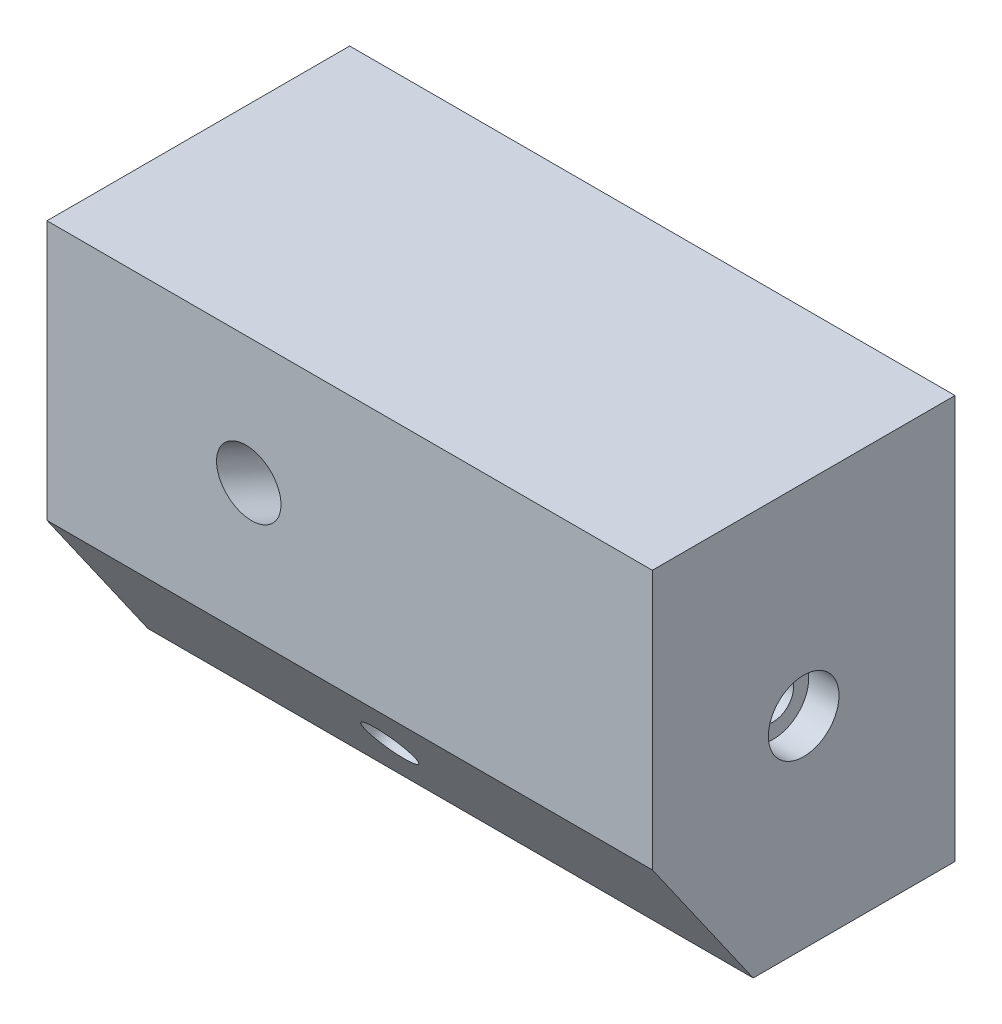
ISO-10303-21;
HEADER;
FILE_DESCRIPTION(('STEP AP214'),'2;1');
FILE_NAME('part.step','',(''),(''),'','','');
FILE_SCHEMA(('AUTOMOTIVE_DESIGN { 1 0 10303 214 1 1 1 1 }'));
ENDSEC;
DATA;
#1=APPLICATION_CONTEXT('core data for automotive mechanical design processes');
#2=APPLICATION_PROTOCOL_DEFINITION('international standard','automotive_design',2000,#1);
#3=PRODUCT_CONTEXT('',#1,'mechanical');
#4=PRODUCT('Part','Part','',(#3));
#5=PRODUCT_RELATED_PRODUCT_CATEGORY('part','',(#4));
#6=PRODUCT_DEFINITION_FORMATION('','',#4);
#7=PRODUCT_DEFINITION_CONTEXT('part definition',#1,'design');
#8=PRODUCT_DEFINITION('design','',#6,#7);
#9=PRODUCT_DEFINITION_SHAPE('','',#8);
#10=(LENGTH_UNIT() NAMED_UNIT(*) SI_UNIT(.MILLI.,.METRE.));
#11=(NAMED_UNIT(*) PLANE_ANGLE_UNIT() SI_UNIT($,.RADIAN.));
#12=(NAMED_UNIT(*) SI_UNIT($,.STERADIAN.) SOLID_ANGLE_UNIT());
#13=UNCERTAINTY_MEASURE_WITH_UNIT(LENGTH_MEASURE(1.E-05),#10,'distance_accuracy_value','');
#14=(GEOMETRIC_REPRESENTATION_CONTEXT(3) GLOBAL_UNCERTAINTY_ASSIGNED_CONTEXT((#13)) GLOBAL_UNIT_ASSIGNED_CONTEXT((#10,
#11,#12)) REPRESENTATION_CONTEXT('',''));
#15=CARTESIAN_POINT('',(0.,0.,0.));
#16=DIRECTION('',(0.,0.,1.));
#17=DIRECTION('',(1.,0.,0.));
#18=AXIS2_PLACEMENT_3D('',#15,#16,#17);
#19=CARTESIAN_POINT('',(0.,80.,60.));
#20=DIRECTION('',(1.,0.,0.));
#21=DIRECTION('',(0.,0.,-1.));
#22=AXIS2_PLACEMENT_3D('',#19,#20,#21);
#23=PLANE('',#22);
#24=DIRECTION('',(0.,0.819151562686394,0.573577124150222));
#25=VECTOR('',#24,1.);
#26=CARTESIAN_POINT('',(0.,31.4192,62.));
#27=LINE('',#26,#25);
#28=CARTESIAN_POINT('',(0.,0.,40.));
#29=VERTEX_POINT('',#28);
#30=CARTESIAN_POINT('',(0.,28.5629090909091,60.));
#31=VERTEX_POINT('',#30);
#32=EDGE_CURVE('E149',#29,#31,#27,.T.);
#33=ORIENTED_EDGE('',*,*,#32,.T.);
#34=DIRECTION('',(0.,-1.,0.));
#35=VECTOR('',#34,1.);
#36=CARTESIAN_POINT('',(0.,80.,60.));
#37=LINE('',#36,#35);
#38=CARTESIAN_POINT('',(0.,80.,60.));
#39=VERTEX_POINT('',#38);
#40=EDGE_CURVE('E112',#39,#31,#37,.T.);
#41=ORIENTED_EDGE('',*,*,#40,.F.);
#42=DIRECTION('',(0.,0.,-1.));
#43=VECTOR('',#42,1.);
#44=CARTESIAN_POINT('',(0.,80.,60.));
#45=LINE('',#44,#43);
#46=CARTESIAN_POINT('',(0.,80.,0.));
#47=VERTEX_POINT('',#46);
#48=EDGE_CURVE('E104',#39,#47,#45,.T.);
#49=ORIENTED_EDGE('',*,*,#48,.T.);
#50=DIRECTION('',(0.,-1.,0.));
#51=VECTOR('',#50,1.);
#52=CARTESIAN_POINT('',(0.,80.,0.));
#53=LINE('',#52,#51);
#54=CARTESIAN_POINT('',(0.,0.,0.));
#55=VERTEX_POINT('',#54);
#56=EDGE_CURVE('E119',#47,#55,#53,.T.);
#57=ORIENTED_EDGE('',*,*,#56,.T.);
#58=DIRECTION('',(0.,0.,-1.));
#59=VECTOR('',#58,1.);
#60=CARTESIAN_POINT('',(0.,0.,60.));
#61=LINE('',#60,#59);
#62=EDGE_CURVE('E66',#29,#55,#61,.T.);
#63=ORIENTED_EDGE('',*,*,#62,.F.);
#64=EDGE_LOOP('',(#33,#41,#49,#57,#63));
#65=FACE_BOUND('',#64,.T.);
#66=ADVANCED_FACE('F57',(#65),#23,.F.);
#67=CARTESIAN_POINT('',(0.,0.,60.));
#68=DIRECTION('',(0.,1.,0.));
#69=DIRECTION('',(0.,0.,1.));
#70=AXIS2_PLACEMENT_3D('',#67,#68,#69);
#71=PLANE('',#70);
#72=DIRECTION('',(-1.,0.,0.));
#73=VECTOR('',#72,1.);
#74=CARTESIAN_POINT('',(120.,0.,40.));
#75=LINE('',#74,#73);
#76=CARTESIAN_POINT('',(120.,0.,40.));
#77=VERTEX_POINT('',#76);
#78=EDGE_CURVE('E127',#77,#29,#75,.T.);
#79=ORIENTED_EDGE('',*,*,#78,.T.);
#80=ORIENTED_EDGE('',*,*,#62,.T.);
#81=DIRECTION('',(1.,0.,0.));
#82=VECTOR('',#81,1.);
#83=CARTESIAN_POINT('',(0.,0.,0.));
#84=LINE('',#83,#82);
#85=CARTESIAN_POINT('',(120.,0.,0.));
#86=VERTEX_POINT('',#85);
#87=EDGE_CURVE('E125',#55,#86,#84,.T.);
#88=ORIENTED_EDGE('',*,*,#87,.T.);
#89=DIRECTION('',(0.,0.,-1.));
#90=VECTOR('',#89,1.);
#91=CARTESIAN_POINT('',(120.,0.,60.));
#92=LINE('',#91,#90);
#93=EDGE_CURVE('E142',#77,#86,#92,.T.);
#94=ORIENTED_EDGE('',*,*,#93,.F.);
#95=EDGE_LOOP('',(#79,#80,#88,#94));
#96=FACE_BOUND('',#95,.T.);
#97=ADVANCED_FACE('F186',(#96),#71,.F.);
#98=CARTESIAN_POINT('',(120.,0.,60.));
#99=DIRECTION('',(-1.,0.,0.));
#100=DIRECTION('',(0.,0.,1.));
#101=AXIS2_PLACEMENT_3D('',#98,#99,#100);
#102=PLANE('',#101);
#103=CARTESIAN_POINT('',(120.,40.,30.));
#104=DIRECTION('',(1.,0.,0.));
#105=DIRECTION('',(0.,0.,-1.));
#106=AXIS2_PLACEMENT_3D('',#103,#104,#105);
#107=CIRCLE('',#106,7.);
#108=CARTESIAN_POINT('',(120.,40.,23.));
#109=VERTEX_POINT('',#108);
#110=EDGE_CURVE('E235',#109,#109,#107,.T.);
#111=ORIENTED_EDGE('',*,*,#110,.F.);
#112=EDGE_LOOP('',(#111));
#113=FACE_BOUND('',#112,.T.);
#114=DIRECTION('',(0.,0.819151562686394,0.573577124150222));
#115=VECTOR('',#114,1.);
#116=CARTESIAN_POINT('',(120.,31.4192,62.));
#117=LINE('',#116,#115);
#118=CARTESIAN_POINT('',(120.,28.5629090909091,60.));
#119=VERTEX_POINT('',#118);
#120=EDGE_CURVE('E74',#77,#119,#117,.T.);
#121=ORIENTED_EDGE('',*,*,#120,.F.);
#122=ORIENTED_EDGE('',*,*,#93,.T.);
#123=DIRECTION('',(0.,1.,0.));
#124=VECTOR('',#123,1.);
#125=CARTESIAN_POINT('',(120.,0.,0.));
#126=LINE('',#125,#124);
#127=CARTESIAN_POINT('',(120.,80.,0.));
#128=VERTEX_POINT('',#127);
#129=EDGE_CURVE('E113',#86,#128,#126,.T.);
#130=ORIENTED_EDGE('',*,*,#129,.T.);
#131=DIRECTION('',(0.,0.,-1.));
#132=VECTOR('',#131,1.);
#133=CARTESIAN_POINT('',(120.,80.,60.));
#134=LINE('',#133,#132);
#135=CARTESIAN_POINT('',(120.,80.,60.));
#136=VERTEX_POINT('',#135);
#137=EDGE_CURVE('E107',#136,#128,#134,.T.);
#138=ORIENTED_EDGE('',*,*,#137,.F.);
#139=DIRECTION('',(0.,1.,0.));
#140=VECTOR('',#139,1.);
#141=CARTESIAN_POINT('',(120.,0.,60.));
#142=LINE('',#141,#140);
#143=EDGE_CURVE('E218',#119,#136,#142,.T.);
#144=ORIENTED_EDGE('',*,*,#143,.F.);
#145=EDGE_LOOP('',(#121,#122,#130,#138,#144));
#146=FACE_BOUND('',#145,.T.);
#147=ADVANCED_FACE('F189',(#113,#146),#102,.F.);
#148=CARTESIAN_POINT('',(0.,0.,60.));
#149=DIRECTION('',(0.,0.,1.));
#150=DIRECTION('',(1.,0.,0.));
#151=AXIS2_PLACEMENT_3D('',#148,#149,#150);
#152=PLANE('',#151);
#153=CARTESIAN_POINT('',(40.0000003036419,55.0000000980999,60.));
#154=DIRECTION('',(0.,0.,1.));
#155=DIRECTION('',(0.80530872119161,-0.592855685283302,0.));
#156=AXIS2_PLACEMENT_3D('',#153,#154,#155);
#157=ELLIPSE('',#156,6.58435719353539,6.);
#158=CARTESIAN_POINT('',(45.3024405750366,51.0964265019764,60.));
#159=VERTEX_POINT('',#158);
#160=EDGE_CURVE('E147',#159,#159,#157,.T.);
#161=ORIENTED_EDGE('',*,*,#160,.F.);
#162=EDGE_LOOP('',(#161));
#163=FACE_BOUND('',#162,.T.);
#164=ORIENTED_EDGE('',*,*,#40,.T.);
#165=DIRECTION('',(1.,0.,0.));
#166=VECTOR('',#165,1.);
#167=CARTESIAN_POINT('',(0.,28.5629090909091,60.));
#168=LINE('',#167,#166);
#169=EDGE_CURVE('E12',#31,#119,#168,.T.);
#170=ORIENTED_EDGE('',*,*,#169,.T.);
#171=ORIENTED_EDGE('',*,*,#143,.T.);
#172=DIRECTION('',(-1.,0.,0.));
#173=VECTOR('',#172,1.);
#174=CARTESIAN_POINT('',(120.,80.,60.));
#175=LINE('',#174,#173);
#176=EDGE_CURVE('E82',#136,#39,#175,.T.);
#177=ORIENTED_EDGE('',*,*,#176,.T.);
#178=EDGE_LOOP('',(#164,#170,#171,#177));
#179=FACE_BOUND('',#178,.T.);
#180=ADVANCED_FACE('F193',(#163,#179),#152,.T.);
#181=CARTESIAN_POINT('',(120.,80.,60.));
#182=DIRECTION('',(0.,-1.,0.));
#183=DIRECTION('',(0.,0.,-1.));
#184=AXIS2_PLACEMENT_3D('',#181,#182,#183);
#185=PLANE('',#184);
#186=DIRECTION('',(-1.,0.,0.));
#187=VECTOR('',#186,1.);
#188=CARTESIAN_POINT('',(120.,80.,0.));
#189=LINE('',#188,#187);
#190=EDGE_CURVE('E101',#128,#47,#189,.T.);
#191=ORIENTED_EDGE('',*,*,#190,.T.);
#192=ORIENTED_EDGE('',*,*,#48,.F.);
#193=ORIENTED_EDGE('',*,*,#176,.F.);
#194=ORIENTED_EDGE('',*,*,#137,.T.);
#195=EDGE_LOOP('',(#191,#192,#193,#194));
#196=FACE_BOUND('',#195,.T.);
#197=ADVANCED_FACE('F103',(#196),#185,.F.);
#198=CARTESIAN_POINT('',(0.,0.,0.));
#199=DIRECTION('',(0.,0.,1.));
#200=DIRECTION('',(1.,0.,0.));
#201=AXIS2_PLACEMENT_3D('',#198,#199,#200);
#202=PLANE('',#201);
#203=ORIENTED_EDGE('',*,*,#56,.F.);
#204=ORIENTED_EDGE('',*,*,#190,.F.);
#205=ORIENTED_EDGE('',*,*,#129,.F.);
#206=ORIENTED_EDGE('',*,*,#87,.F.);
#207=EDGE_LOOP('',(#203,#204,#205,#206));
#208=FACE_BOUND('',#207,.T.);
#209=ADVANCED_FACE('F123',(#208),#202,.F.);
#210=CARTESIAN_POINT('',(120.,31.4192,62.));
#211=DIRECTION('',(0.,-0.573577124150222,0.819151562686394));
#212=DIRECTION('',(0.,-0.819151562686394,-0.573577124150222));
#213=AXIS2_PLACEMENT_3D('',#210,#211,#212);
#214=PLANE('',#213);
#215=CARTESIAN_POINT('',(57.9402,14.2814852266807,50.0000214832642));
#216=DIRECTION('',(0.,-0.573577124150222,0.819151562686394));
#217=DIRECTION('',(0.,-0.819151562686394,-0.573577124150222));
#218=AXIS2_PLACEMENT_3D('',#215,#216,#217);
#219=CIRCLE('',#218,5.);
#220=CARTESIAN_POINT('',(57.9402,10.1857274132487,47.1321358625131));
#221=VERTEX_POINT('',#220);
#222=EDGE_CURVE('E159',#221,#221,#219,.T.);
#223=ORIENTED_EDGE('',*,*,#222,.F.);
#224=EDGE_LOOP('',(#223));
#225=FACE_BOUND('',#224,.T.);
#226=ORIENTED_EDGE('',*,*,#32,.F.);
#227=ORIENTED_EDGE('',*,*,#78,.F.);
#228=ORIENTED_EDGE('',*,*,#120,.T.);
#229=ORIENTED_EDGE('',*,*,#169,.F.);
#230=EDGE_LOOP('',(#226,#227,#228,#229));
#231=FACE_BOUND('',#230,.T.);
#232=ADVANCED_FACE('F181',(#225,#231),#214,.T.);
#233=CARTESIAN_POINT('',(36.683319,57.441689,69.112507));
#234=DIRECTION('',(0.331668124744669,-0.244168886053008,-0.911250684560504));
#235=DIRECTION('',(-0.939692620915183,0.,-0.342020142970491));
#236=AXIS2_PLACEMENT_3D('',#233,#234,#235);
#237=CYLINDRICAL_SURFACE('',#236,6.);
#238=CARTESIAN_POINT('',(57.9402,39.8426155637151,22.2121782988887));
#239=CARTESIAN_POINT('',(57.8039877038304,39.784658133727,22.2949512649592));
#240=CARTESIAN_POINT('',(57.6635682031201,39.7252941387798,22.370047816477));
#241=CARTESIAN_POINT('',(57.3744584749812,39.6042422034476,22.500326589461));
#242=CARTESIAN_POINT('',(57.2257633712298,39.5425528999544,22.5554969230898));
#243=CARTESIAN_POINT('',(56.9194975007161,39.417096514862,22.6406415910337));
#244=CARTESIAN_POINT('',(56.7618422358309,39.3533134510199,22.670308605789));
#245=CARTESIAN_POINT('',(56.5232831422183,39.2583231771456,22.6905297322477));
#246=CARTESIAN_POINT('',(56.4434540827091,39.2267879519921,22.6932278134429));
#247=CARTESIAN_POINT('',(56.283738837589,39.1642408542226,22.6900248079423));
#248=CARTESIAN_POINT('',(56.2038526637015,39.1332288953494,22.6841251528194));
#249=CARTESIAN_POINT('',(56.0520564241629,39.0748547177211,22.6643405599156));
#250=CARTESIAN_POINT('',(55.9800754977155,39.047415192346,22.6512219589239));
#251=CARTESIAN_POINT('',(55.8374424177545,38.9935381506762,22.6175963195989));
#252=CARTESIAN_POINT('',(55.7667907437992,38.967100992644,22.5970866665885));
#253=CARTESIAN_POINT('',(55.627504110675,38.9154831158034,22.548909853829));
#254=CARTESIAN_POINT('',(55.5588690326735,38.8903023228995,22.5212431167735));
#255=CARTESIAN_POINT('',(55.4241563982202,38.8413759316318,22.4591970009049));
#256=CARTESIAN_POINT('',(55.3580799645361,38.8176309608161,22.4248147143347));
#257=CARTESIAN_POINT('',(55.1794735876445,38.7541203356935,22.3212182566648));
#258=CARTESIAN_POINT('',(55.0700865585192,38.7159988252894,22.2454824077129));
#259=CARTESIAN_POINT('',(54.8620666969831,38.6448703505473,22.0787314452129));
#260=CARTESIAN_POINT('',(54.7634365064151,38.6118646417982,21.9877125920877));
#261=CARTESIAN_POINT('',(54.5124752690338,38.5295082879465,21.727059984335));
#262=CARTESIAN_POINT('',(54.3700026157656,38.4845774065977,21.5464898902117));
#263=CARTESIAN_POINT('',(54.176855989345,38.4255962595804,21.2605179673358));
#264=CARTESIAN_POINT('',(54.1158095358231,38.4073131086461,21.1624842382393));
#265=CARTESIAN_POINT('',(53.9999820837577,38.3732108648322,20.9623564872389));
#266=CARTESIAN_POINT('',(53.9451998596722,38.3573912897556,20.8602632648253));
#267=CARTESIAN_POINT('',(53.8003574398024,38.3162560387586,20.5710094609751));
#268=CARTESIAN_POINT('',(53.7166122865105,38.2933099450598,20.3803546926317));
#269=CARTESIAN_POINT('',(53.5647647249894,38.2527386291317,19.9923262880494));
#270=CARTESIAN_POINT('',(53.4966759300887,38.2351180333119,19.7949469746731));
#271=CARTESIAN_POINT('',(53.3738613755543,38.2038726046906,19.3949557389383));
#272=CARTESIAN_POINT('',(53.3191894595526,38.1902638292714,19.192326228102));
#273=CARTESIAN_POINT('',(53.221940735386,38.16602632568,18.7839746650922));
#274=CARTESIAN_POINT('',(53.1793680678022,38.155398617699,18.5782515795399));
#275=CARTESIAN_POINT('',(53.1096541511456,38.1372937806302,18.1896614138238));
#276=CARTESIAN_POINT('',(53.081272239508,38.1295913987907,18.0070239444184));
#277=CARTESIAN_POINT('',(53.0324493352196,38.1150709806842,17.6406540287694));
#278=CARTESIAN_POINT('',(53.0120086520074,38.1082529788849,17.4569215401405));
#279=CARTESIAN_POINT('',(52.9787024683646,38.0948118312487,17.0884685302951));
#280=CARTESIAN_POINT('',(52.9658492872428,38.0881890187976,16.9037468909687));
#281=CARTESIAN_POINT('',(52.9476321852254,38.0743986828511,16.5339548619442));
#282=CARTESIAN_POINT('',(52.9422682489295,38.067231160476,16.3488844729641));
#283=CARTESIAN_POINT('',(52.9391201342755,38.0515123411151,15.9795962017501));
#284=CARTESIAN_POINT('',(52.9413008079597,38.0429676371409,15.7953783591296));
#285=CARTESIAN_POINT('',(52.9535048957768,38.0234134902043,15.4272838070698));
#286=CARTESIAN_POINT('',(52.9635298226211,38.0124035721344,15.2434071702862));
#287=CARTESIAN_POINT('',(52.9920606058182,37.9866102967845,14.8769814151585));
#288=CARTESIAN_POINT('',(53.0105472034314,37.9718355419327,14.6944302334293));
#289=CARTESIAN_POINT('',(53.0570804146525,37.9367900121151,14.3311216204349));
#290=CARTESIAN_POINT('',(53.0851214707017,37.916522433569,14.1503632091265));
#291=CARTESIAN_POINT('',(53.1397055613891,37.8774002890075,13.8598226323932));
#292=CARTESIAN_POINT('',(53.1627976519762,37.8609149852681,13.7490742194168));
#293=CARTESIAN_POINT('',(53.2138772482162,37.8243205107313,13.5292884029596));
#294=CARTESIAN_POINT('',(53.2418651829162,37.8042110223239,13.4202511503496));
#295=CARTESIAN_POINT('',(53.3033130094751,37.7597290134358,13.2048518737301));
#296=CARTESIAN_POINT('',(53.3367604615043,37.7353661758782,13.0984843878288));
#297=CARTESIAN_POINT('',(53.409845760958,37.6817162173147,12.8892155903358));
#298=CARTESIAN_POINT('',(53.4494821398913,37.6524302643259,12.7863134635166));
#299=CARTESIAN_POINT('',(53.5624987182004,37.5684053474016,12.5227621489585));
#300=CARTESIAN_POINT('',(53.6415770887987,37.5091337125177,12.3658053312409));
#301=CARTESIAN_POINT('',(53.7753131002192,37.4092125097617,12.1447437015737));
#302=CARTESIAN_POINT('',(53.8224078487145,37.3740725424897,12.0734563894166));
#303=CARTESIAN_POINT('',(53.9216824543319,37.3004628436215,11.9363673717493));
#304=CARTESIAN_POINT('',(53.9738601953855,37.2619944983809,11.8705634044916));
#305=CARTESIAN_POINT('',(54.0832900949905,37.182190598304,11.7448992467268));
#306=CARTESIAN_POINT('',(54.1405533292255,37.140848830196,11.6850526628242));
#307=CARTESIAN_POINT('',(54.2597554481373,37.0561387077595,11.5718052489947));
#308=CARTESIAN_POINT('',(54.3216944170742,37.0127703169152,11.5184045352721));
#309=CARTESIAN_POINT('',(54.4499529392231,36.9247951491857,11.4180244436125));
#310=CARTESIAN_POINT('',(54.5162795577431,36.8801864454677,11.3710558156989));
#311=CARTESIAN_POINT('',(54.6527964886081,36.7906566100943,11.283444118957));
#312=CARTESIAN_POINT('',(54.7229878260814,36.7457353983326,11.2428027394989));
#313=CARTESIAN_POINT('',(54.8876066537276,36.6434673253295,11.1566075749145));
#314=CARTESIAN_POINT('',(54.9831730975512,36.5862836725856,11.1130317464522));
#315=CARTESIAN_POINT('',(55.1792027025236,36.4742232283291,11.0348566901161));
#316=CARTESIAN_POINT('',(55.2796673535379,36.4193471482731,11.0002602139411));
#317=CARTESIAN_POINT('',(55.4848666440391,36.313068326546,10.9390304033599));
#318=CARTESIAN_POINT('',(55.5896046753589,36.2616684334653,10.9124035399563));
#319=CARTESIAN_POINT('',(55.8027139970433,36.1633392882035,10.8662275117586));
#320=CARTESIAN_POINT('',(55.911086665636,36.1164117584245,10.8466810657321));
#321=CARTESIAN_POINT('',(56.1335445268968,36.0267639341843,10.8134911452147));
#322=CARTESIAN_POINT('',(56.2477044598826,35.9841724553227,10.8000014599433));
#323=CARTESIAN_POINT('',(56.4787302518931,35.9052024223068,10.7789115791658));
#324=CARTESIAN_POINT('',(56.5955971227057,35.8688262352635,10.7713136236603));
#325=CARTESIAN_POINT('',(56.8314000645951,35.8028998522317,10.7614275783025));
#326=CARTESIAN_POINT('',(56.9503351008932,35.7733463426002,10.7591369058993));
#327=CARTESIAN_POINT('',(57.1897788259446,35.7215251912446,10.7593691431837));
#328=CARTESIAN_POINT('',(57.3102875788463,35.699257847492,10.7618922497044));
#329=CARTESIAN_POINT('',(57.5715672603899,35.6594817561867,10.7720947283296));
#330=CARTESIAN_POINT('',(57.7125125255323,35.6432930693112,10.7805303450211));
#331=CARTESIAN_POINT('',(57.9948182318801,35.6217462527665,10.802781815074));
#332=CARTESIAN_POINT('',(58.1361787125819,35.6163891892017,10.8165981978788));
#333=CARTESIAN_POINT('',(58.4183198474696,35.6168641344787,10.8491547931855));
#334=CARTESIAN_POINT('',(58.5591004934651,35.6226963008323,10.8678950749984));
#335=CARTESIAN_POINT('',(58.8391075681365,35.6457672813974,10.9099081142732));
#336=CARTESIAN_POINT('',(58.978333307555,35.6630109647634,10.9331828035186));
#337=CARTESIAN_POINT('',(59.2515109786812,35.7085343030989,10.9834228029794));
#338=CARTESIAN_POINT('',(59.3855128509664,35.736600075965,11.0103103816871));
#339=CARTESIAN_POINT('',(59.6498743706314,35.8036629482814,11.0677783200613));
#340=CARTESIAN_POINT('',(59.7802356948856,35.8426549205424,11.0983569438592));
#341=CARTESIAN_POINT('',(60.0364001334911,35.9313354682404,11.1629413001381));
#342=CARTESIAN_POINT('',(60.1622029788192,35.9810246737879,11.1969472344387));
#343=CARTESIAN_POINT('',(60.4082923363608,36.0907104977413,11.2681386711233));
#344=CARTESIAN_POINT('',(60.5285789420874,36.1507069413336,11.3053241195763));
#345=CARTESIAN_POINT('',(60.7594548495044,36.278658153259,11.381579319769));
#346=CARTESIAN_POINT('',(60.8702216254031,36.3463420751118,11.4205668153825));
#347=CARTESIAN_POINT('',(61.0849898900337,36.4903805170068,11.5012134227472));
#348=CARTESIAN_POINT('',(61.1889891924772,36.5667378173974,11.5428733893155));
#349=CARTESIAN_POINT('',(61.3894713366186,36.7273851199449,11.628741995847));
#350=CARTESIAN_POINT('',(61.4859567886543,36.8116723445457,11.6729497413318));
#351=CARTESIAN_POINT('',(61.6708575967854,36.9874279642735,11.7638977941853));
#352=CARTESIAN_POINT('',(61.759272660389,37.0788966194507,11.810638193246));
#353=CARTESIAN_POINT('',(61.9290510212717,37.2698964928314,11.9075815068072));
#354=CARTESIAN_POINT('',(62.0102553210453,37.3695447800698,11.9578321904225));
#355=CARTESIAN_POINT('',(62.1632482160144,37.5743904786476,12.061152472234));
#356=CARTESIAN_POINT('',(62.2350397104519,37.6795861672653,12.1142211953354));
#357=CARTESIAN_POINT('',(62.3689385135558,37.8946827659885,12.223578121074));
#358=CARTESIAN_POINT('',(62.4310284726459,38.0045916676408,12.2798718509439));
#359=CARTESIAN_POINT('',(62.5449960211186,38.2277619139685,12.3960428997357));
#360=CARTESIAN_POINT('',(62.5968735954541,38.3410232635831,12.4559202239375));
#361=CARTESIAN_POINT('',(62.6917438203497,38.573673331953,12.5821225392375));
#362=CARTESIAN_POINT('',(62.7343511620255,38.6931361334296,12.6486017423305));
#363=CARTESIAN_POINT('',(62.8078827077117,38.9325362628812,12.7870613210334));
#364=CARTESIAN_POINT('',(62.8388040979691,39.0524736981234,12.8590430165283));
#365=CARTESIAN_POINT('',(62.8885488188719,39.2903328570806,13.0094642749204));
#366=CARTESIAN_POINT('',(62.9074068215031,39.4082594007938,13.0878845924984));
#367=CARTESIAN_POINT('',(62.9329151440668,39.6397819390446,13.2526635655906));
#368=CARTESIAN_POINT('',(62.9395749544172,39.7533812328194,13.3390159947952));
#369=CARTESIAN_POINT('',(62.94052970966,39.9331525393896,13.4877919227765));
#370=CARTESIAN_POINT('',(62.9384377329218,40.0015615905778,13.5475117723326));
#371=CARTESIAN_POINT('',(62.929440131825,40.1344371435255,13.6708357982663));
#372=CARTESIAN_POINT('',(62.9225360470696,40.1989048991035,13.7344387263411));
#373=CARTESIAN_POINT('',(62.9041400951134,40.3229090051929,13.8654615613655));
#374=CARTESIAN_POINT('',(62.8926561658939,40.3824536741329,13.9328746916937));
#375=CARTESIAN_POINT('',(62.8654330509106,40.4959508776116,14.0714524878212));
#376=CARTESIAN_POINT('',(62.8496937929244,40.5499033172162,14.1426172172769));
#377=CARTESIAN_POINT('',(62.8143962970037,40.6516539520646,14.2883547499406));
#378=CARTESIAN_POINT('',(62.7948368765264,40.6994502340293,14.3629286029639));
#379=CARTESIAN_POINT('',(62.752412994933,40.788605152877,14.5149437898807));
#380=CARTESIAN_POINT('',(62.729547202955,40.8299611834777,14.5923862690559));
#381=CARTESIAN_POINT('',(62.6567449076491,40.9443999797928,14.8282742811809));
#382=CARTESIAN_POINT('',(62.6026229450355,41.0078003039864,14.990203356785));
#383=CARTESIAN_POINT('',(62.4989041194968,41.100894528027,15.2845915926833));
#384=CARTESIAN_POINT('',(62.4506616414813,41.1348371287308,15.4162712170582));
#385=CARTESIAN_POINT('',(62.3506445293987,41.1905710404806,15.680932232674));
#386=CARTESIAN_POINT('',(62.298867398343,41.2123536595302,15.8139144861254));
#387=CARTESIAN_POINT('',(62.1923701484199,41.2459273080412,16.0804330071364));
#388=CARTESIAN_POINT('',(62.1376405220954,41.2576837232163,16.2139696073634));
#389=CARTESIAN_POINT('',(62.0257590676454,41.2729499355967,16.4805324065817));
#390=CARTESIAN_POINT('',(61.9686062170467,41.2764562157061,16.6135583637647));
#391=CARTESIAN_POINT('',(61.8462274750012,41.2767063219376,16.8918988600607));
#392=CARTESIAN_POINT('',(61.7807665745358,41.272737142205,17.0371087348838));
#393=CARTESIAN_POINT('',(61.6471934327619,41.2581119410632,17.3259253821414));
#394=CARTESIAN_POINT('',(61.5790814506044,41.2474565717162,17.4695323095114));
#395=CARTESIAN_POINT('',(61.4400475791893,41.2205665238496,17.7550446358539));
#396=CARTESIAN_POINT('',(61.3691225820336,41.2043255131564,17.896947913708));
#397=CARTESIAN_POINT('',(61.2243866424306,41.1671035500878,18.1786592032213));
#398=CARTESIAN_POINT('',(61.150575385719,41.1461220803622,18.3184669844113));
#399=CARTESIAN_POINT('',(60.9997427916696,41.0999999689429,18.5959914880706));
#400=CARTESIAN_POINT('',(60.9227156466141,41.0748515353394,18.7337037551644));
#401=CARTESIAN_POINT('',(60.7653471865775,41.0208862114459,19.0065080132416));
#402=CARTESIAN_POINT('',(60.6850055652817,40.9920689815802,19.1415997603399));
#403=CARTESIAN_POINT('',(60.5208231594729,40.931137182457,19.4087158274709));
#404=CARTESIAN_POINT('',(60.4369855266426,40.8990255465569,19.5407427501528));
#405=CARTESIAN_POINT('',(60.2654466223956,40.8317314304596,19.8014616617805));
#406=CARTESIAN_POINT('',(60.1777453454221,40.7965489458458,19.9301536459294));
#407=CARTESIAN_POINT('',(59.9636413156988,40.7092171429419,20.2324403325837));
#408=CARTESIAN_POINT('',(59.8353102167157,40.6557407591267,20.4042995026124));
#409=CARTESIAN_POINT('',(59.5694808847069,40.5434950879366,20.7391472423195));
#410=CARTESIAN_POINT('',(59.4319786466314,40.4847234841485,20.9021318792931));
#411=CARTESIAN_POINT('',(59.1474836092547,40.36240536505,21.215810717328));
#412=CARTESIAN_POINT('',(59.0005536242492,40.2988900679006,21.3665736458057));
#413=CARTESIAN_POINT('',(58.695178777739,40.1668643781618,21.6534031236249));
#414=CARTESIAN_POINT('',(58.536748727262,40.0983604101657,21.789488034178));
#415=CARTESIAN_POINT('',(58.3023227769034,39.9974870581366,21.9689542753706));
#416=CARTESIAN_POINT('',(58.2316304933516,39.9671272031354,22.0204406183318));
#417=CARTESIAN_POINT('',(58.0877789346091,39.9055239120153,22.119443738114));
#418=CARTESIAN_POINT('',(58.0146173513093,39.8742796538869,22.1669566480672));
#419=CARTESIAN_POINT('',(57.9402,39.8426155637151,22.2121782988887));
#420=B_SPLINE_CURVE_WITH_KNOTS('',3,(#238,#239,#240,#241,#242,#243,#244,#245,#246,#247,#248,
#249,#250,#251,#252,#253,#254,#255,#256,#257,#258,#259,#260,#261,#262,#263,#264,#265,#266,#267,
#268,#269,#270,#271,#272,#273,#274,#275,#276,#277,#278,#279,#280,#281,#282,#283,#284,#285,#286,
#287,#288,#289,#290,#291,#292,#293,#294,#295,#296,#297,#298,#299,#300,#301,#302,#303,#304,#305,
#306,#307,#308,#309,#310,#311,#312,#313,#314,#315,#316,#317,#318,#319,#320,#321,#322,#323,#324,
#325,#326,#327,#328,#329,#330,#331,#332,#333,#334,#335,#336,#337,#338,#339,#340,#341,#342,#343,
#344,#345,#346,#347,#348,#349,#350,#351,#352,#353,#354,#355,#356,#357,#358,#359,#360,#361,#362,
#363,#364,#365,#366,#367,#368,#369,#370,#371,#372,#373,#374,#375,#376,#377,#378,#379,#380,#381,
#382,#383,#384,#385,#386,#387,#388,#389,#390,#391,#392,#393,#394,#395,#396,#397,#398,#399,#400,
#401,#402,#403,#404,#405,#406,#407,#408,#409,#410,#411,#412,#413,#414,#415,#416,#417,#418,#419),
.UNSPECIFIED.,.T.,.F.,(4,2,2,2,2,2,2,2,2,2,2,2,2,2,2,2,2,2,2,2,2,2,2,2,2,2,2,2,2,2,2,2,2,2,2,2,
2,2,2,2,2,2,2,2,2,2,2,2,2,2,2,2,2,2,2,2,2,2,2,2,2,2,2,2,2,2,2,2,2,2,2,2,2,2,2,2,2,2,2,2,2,2,2,2,
2,2,2,2,2,2,4),(0.,0.508634997209118,1.01757294308341,1.53256100113523,1.78982180862998,
2.04703978560406,2.28111172285953,2.51526654741042,2.74940754605632,2.98365015074879,
3.39713235420599,3.81071587988381,4.50944178145872,4.86007012950412,5.21062976236825,
5.83809768914082,6.46610915837629,7.09660115035806,7.72730864896694,8.28209601015391,
8.83690498706504,9.39261230929785,9.9483184888037,10.5014393013727,11.0546668058528,
11.6066413795297,12.1582954317308,12.5011282835046,12.843991194489,13.1860835068824,
13.5280947715766,14.0818587262102,14.3587035795789,14.6354336699771,14.9127819663375,
15.1901352619107,15.4679465870882,15.7458319609216,16.1040745507543,16.462426793806,
16.8210692199005,17.1798492133568,17.5472849677544,17.9148603506438,18.2822568318973,
18.6496683361395,19.0755138826947,19.5014013411329,19.9272947948687,20.3533700893904,
20.7714238196671,21.189281703118,21.6071642068299,22.0250396238361,22.4311785043411,
22.837447946593,23.2435756139013,23.6497179944872,24.0633062334034,24.4767667820701,
24.8909584757759,25.3051507797556,25.7341954970061,26.1633434542819,26.5912523674221,
27.0188282179192,27.2910697159123,27.5632241519409,27.8349089142699,28.1065982879828,
28.3783718976315,28.6502552061481,29.1943049894186,29.6265921938284,30.0591880042328,
30.4932713236329,30.9275396625813,31.4053336011895,31.8830809507772,32.3613716946541,
32.8397146620412,33.3189624037551,33.7982545358807,34.2771235477978,34.7559932484596,
35.4187646386708,36.0818273815276,36.740856996943,37.3990524083126,37.6766696851152,
37.9545540636913),.UNSPECIFIED.);
#421=CARTESIAN_POINT('',(57.9402,39.8426155637151,22.2121782988887));
#422=VERTEX_POINT('',#421);
#423=EDGE_CURVE('E151',#422,#422,#420,.T.);
#424=ORIENTED_EDGE('',*,*,#423,.T.);
#425=EDGE_LOOP('',(#424));
#426=FACE_BOUND('',#425,.T.);
#427=ORIENTED_EDGE('',*,*,#160,.T.);
#428=EDGE_LOOP('',(#427));
#429=FACE_BOUND('',#428,.T.);
#430=CARTESIAN_POINT('',(58.926443,41.066649,8.00002600000001));
#431=DIRECTION('',(-0.331668124744669,0.244168886053009,0.911250684560505));
#432=DIRECTION('',(-0.939692620915183,0.,-0.342020142970491));
#433=AXIS2_PLACEMENT_3D('',#430,#431,#432);
#434=CIRCLE('',#433,6.);
#435=CARTESIAN_POINT('',(53.2882872745089,41.066649,5.94790514217706));
#436=VERTEX_POINT('',#435);
#437=EDGE_CURVE('E232',#436,#436,#434,.T.);
#438=ORIENTED_EDGE('',*,*,#437,.F.);
#439=EDGE_LOOP('',(#438));
#440=FACE_BOUND('',#439,.T.);
#441=ADVANCED_FACE('F161',(#426,#429,#440),#237,.F.);
#442=CARTESIAN_POINT('',(58.926443,41.066649,8.00002600000001));
#443=DIRECTION('',(-0.331668124744669,0.244168886053009,0.911250684560505));
#444=DIRECTION('',(-0.939692620915183,0.,-0.342020142970491));
#445=AXIS2_PLACEMENT_3D('',#442,#443,#444);
#446=CONICAL_SURFACE('',#445,6.,1.02974425867665);
#447=CARTESIAN_POINT('',(60.121164456901,40.1871137492136,4.7175557707662));
#448=DIRECTION('',(0.331668124744669,-0.244168886053009,-0.911250684560505));
#449=DIRECTION('',(-0.939692620915183,0.,-0.342020142970491));
#450=AXIS2_PLACEMENT_3D('',#447,#448,#449);
#451=CIRCLE('',#450,0.00500000000000409);
#452=CARTESIAN_POINT('',(60.1164659937964,40.1871137492136,4.71584567005135));
#453=VERTEX_POINT('',#452);
#454=EDGE_CURVE('E150',#453,#453,#451,.F.);
#455=CARTESIAN_POINT('',(53.2882872745089,41.066649,5.94790514217706));
#456=CARTESIAN_POINT('',(53.3594141361682,41.057487174471,5.93507118934242));
#457=CARTESIAN_POINT('',(53.4305409978274,41.048325348942,5.92223723650778));
#458=CARTESIAN_POINT('',(53.5727947211459,41.0300016978839,5.89656933083849));
#459=CARTESIAN_POINT('',(53.6439215828051,41.0208398723549,5.88373537800385));
#460=CARTESIAN_POINT('',(53.7861753061236,41.0025162212968,5.85806747233456));
#461=CARTESIAN_POINT('',(53.8573021677829,40.9933543957678,5.84523351949992));
#462=CARTESIAN_POINT('',(53.9995558911014,40.9750307447098,5.81956561383063));
#463=CARTESIAN_POINT('',(54.0706827527606,40.9658689191807,5.80673166099599));
#464=CARTESIAN_POINT('',(54.2129364760791,40.9475452681227,5.7810637553267));
#465=CARTESIAN_POINT('',(54.2840633377383,40.9383834425937,5.76822980249206));
#466=CARTESIAN_POINT('',(54.4263170610568,40.9200597915356,5.74256189682278));
#467=CARTESIAN_POINT('',(54.4974439227161,40.9108979660066,5.72972794398813));
#468=CARTESIAN_POINT('',(54.6396976460346,40.8925743149485,5.70406003831885));
#469=CARTESIAN_POINT('',(54.7108245076938,40.8834124894195,5.6912260854842));
#470=CARTESIAN_POINT('',(54.8530782310123,40.8650888383615,5.66555817981492));
#471=CARTESIAN_POINT('',(54.9242050926715,40.8559270128324,5.65272422698028));
#472=CARTESIAN_POINT('',(55.06645881599,40.8376033617744,5.62705632131099));
#473=CARTESIAN_POINT('',(55.1375856776493,40.8284415362454,5.61422236847635));
#474=CARTESIAN_POINT('',(55.2798394009678,40.8101178851873,5.58855446280706));
#475=CARTESIAN_POINT('',(55.350966262627,40.8009560596583,5.57572050997242));
#476=CARTESIAN_POINT('',(55.4932199859455,40.7826324086002,5.55005260430313));
#477=CARTESIAN_POINT('',(55.5643468476048,40.7734705830712,5.53721865146849));
#478=CARTESIAN_POINT('',(55.7066005709232,40.7551469320132,5.5115507457992));
#479=CARTESIAN_POINT('',(55.7777274325825,40.7459851064841,5.49871679296456));
#480=CARTESIAN_POINT('',(55.919981155901,40.7276614554261,5.47304888729528));
#481=CARTESIAN_POINT('',(55.9911080175602,40.7184996298971,5.46021493446063));
#482=CARTESIAN_POINT('',(56.1333617408787,40.700175978839,5.43454702879135));
#483=CARTESIAN_POINT('',(56.204488602538,40.69101415331,5.4217130759567));
#484=CARTESIAN_POINT('',(56.3467423258565,40.6726905022519,5.39604517028742));
#485=CARTESIAN_POINT('',(56.4178691875157,40.6635286767229,5.38321121745278));
#486=CARTESIAN_POINT('',(56.5601229108342,40.6452050256649,5.35754331178349));
#487=CARTESIAN_POINT('',(56.6312497724934,40.6360432001359,5.34470935894885));
#488=CARTESIAN_POINT('',(56.7735034958119,40.6177195490778,5.31904145327956));
#489=CARTESIAN_POINT('',(56.8446303574712,40.6085577235488,5.30620750044492));
#490=CARTESIAN_POINT('',(56.9868840807897,40.5902340724907,5.28053959477563));
#491=CARTESIAN_POINT('',(57.0580109424489,40.5810722469617,5.26770564194099));
#492=CARTESIAN_POINT('',(57.2002646657674,40.5627485959036,5.2420377362717));
#493=CARTESIAN_POINT('',(57.2713915274266,40.5535867703746,5.22920378343706));
#494=CARTESIAN_POINT('',(57.4136452507451,40.5352631193166,5.20353587776778));
#495=CARTESIAN_POINT('',(57.4847721124044,40.5261012937876,5.19070192493313));
#496=CARTESIAN_POINT('',(57.6270258357229,40.5077776427295,5.16503401926385));
#497=CARTESIAN_POINT('',(57.6981526973821,40.4986158172005,5.1522000664292));
#498=CARTESIAN_POINT('',(57.8404064207006,40.4802921661424,5.12653216075992));
#499=CARTESIAN_POINT('',(57.9115332823599,40.4711303406134,5.11369820792528));
#500=CARTESIAN_POINT('',(58.0537870056783,40.4528066895554,5.08803030225599));
#501=CARTESIAN_POINT('',(58.1249138673376,40.4436448640263,5.07519634942135));
#502=CARTESIAN_POINT('',(58.2671675906561,40.4253212129683,5.04952844375206));
#503=CARTESIAN_POINT('',(58.3382944523153,40.4161593874393,5.03669449091742));
#504=CARTESIAN_POINT('',(58.4805481756338,40.3978357363812,5.01102658524813));
#505=CARTESIAN_POINT('',(58.551675037293,40.3886739108522,4.99819263241349));
#506=CARTESIAN_POINT('',(58.6939287606115,40.3703502597941,4.9725247267442));
#507=CARTESIAN_POINT('',(58.7650556222708,40.3611884342651,4.95969077390956));
#508=CARTESIAN_POINT('',(58.9073093455893,40.3428647832071,4.93402286824028));
#509=CARTESIAN_POINT('',(58.9784362072485,40.333702957678,4.92118891540563));
#510=CARTESIAN_POINT('',(59.120689930567,40.31537930662,4.89552100973635));
#511=CARTESIAN_POINT('',(59.1918167922263,40.306217481091,4.88268705690171));
#512=CARTESIAN_POINT('',(59.3340705155447,40.2878938300329,4.85701915123242));
#513=CARTESIAN_POINT('',(59.405197377204,40.2787320045039,4.84418519839778));
#514=CARTESIAN_POINT('',(59.5474511005225,40.2604083534458,4.81851729272849));
#515=CARTESIAN_POINT('',(59.6185779621817,40.2512465279168,4.80568333989385));
#516=CARTESIAN_POINT('',(59.7608316855002,40.2329228768588,4.78001543422456));
#517=CARTESIAN_POINT('',(59.8319585471595,40.2237610513297,4.76718148138992));
#518=CARTESIAN_POINT('',(59.974212270478,40.2054374002717,4.74151357572063));
#519=CARTESIAN_POINT('',(60.0453391321372,40.1962755747427,4.72867962288599));
#520=CARTESIAN_POINT('',(60.1164659937964,40.1871137492136,4.71584567005135));
#521=B_SPLINE_CURVE_WITH_KNOTS('',3,(#455,#456,#457,#458,#459,#460,#461,#462,#463,#464,#465,
#466,#467,#468,#469,#470,#471,#472,#473,#474,#475,#476,#477,#478,#479,#480,#481,#482,#483,#484,
#485,#486,#487,#488,#489,#490,#491,#492,#493,#494,#495,#496,#497,#498,#499,#500,#501,#502,#503,
#504,#505,#506,#507,#508,#509,#510,#511,#512,#513,#514,#515,#516,#517,#518,#519,#520),
.UNSPECIFIED.,.F.,.F.,(4,2,2,2,2,2,2,2,2,2,2,2,2,2,2,2,2,2,2,2,2,2,2,2,2,2,2,2,2,2,2,2,4),(0.,
0.218561475509563,0.437122951019126,0.655684426528682,0.874245902038245,1.0928073775478,
1.31136885305736,1.52993032856692,1.74849180407648,1.96705327958604,2.1856147550956,
2.40417623060516,2.62273770611472,2.84129918162428,3.05986065713384,3.27842213264339,
3.49698360815296,3.71554508366252,3.93410655917208,4.15266803468164,4.3712295101912,
4.58979098570076,4.80835246121031,5.02691393671987,5.24547541222943,5.46403688773899,
5.68259836324855,5.90115983875811,6.11972131426767,6.33828278977723,6.55684426528679,
6.77540574079635,6.99396721630591),.UNSPECIFIED.);
#522=EDGE_CURVE('BSEAM175',#436,#453,#521,.T.);
#523=ORIENTED_EDGE('',*,*,#437,.T.);
#524=ORIENTED_EDGE('',*,*,#454,.F.);
#525=ORIENTED_EDGE('',*,*,#522,.T.);
#526=ORIENTED_EDGE('',*,*,#522,.F.);
#527=EDGE_LOOP('',(#523,#525,#524,#526));
#528=FACE_BOUND('',#527,.T.);
#529=ADVANCED_FACE('F175',(#528),#446,.F.);
#530=CARTESIAN_POINT('',(60.121164456901,40.1871137492136,4.7175557707662));
#531=DIRECTION('',(0.331668124744669,-0.244168886053009,-0.911250684560505));
#532=DIRECTION('',(-0.939692620915183,0.,-0.342020142970491));
#533=AXIS2_PLACEMENT_3D('',#530,#531,#532);
#534=PLANE('',#533);
#535=ORIENTED_EDGE('',*,*,#454,.T.);
#536=EDGE_LOOP('',(#535));
#537=FACE_BOUND('',#536,.T.);
#538=ADVANCED_FACE('F171',(#537),#534,.F.);
#539=CARTESIAN_POINT('',(57.9402,9.692889,56.553216));
#540=DIRECTION('',(0.,0.573576438591197,-0.819152042720422));
#541=DIRECTION('',(0.,0.819152042720422,0.573576438591197));
#542=AXIS2_PLACEMENT_3D('',#539,#540,#541);
#543=CYLINDRICAL_SURFACE('',#542,5.);
#544=ORIENTED_EDGE('',*,*,#222,.T.);
#545=EDGE_LOOP('',(#544));
#546=FACE_BOUND('',#545,.T.);
#547=ORIENTED_EDGE('',*,*,#423,.F.);
#548=EDGE_LOOP('',(#547));
#549=FACE_BOUND('',#548,.T.);
#550=ADVANCED_FACE('F165',(#546,#549),#543,.F.);
#551=CARTESIAN_POINT('',(114.,40.,30.));
#552=DIRECTION('',(1.,0.,0.));
#553=DIRECTION('',(0.,0.,-1.));
#554=AXIS2_PLACEMENT_3D('',#551,#552,#553);
#555=CYLINDRICAL_SURFACE('',#554,7.);
#556=CARTESIAN_POINT('',(114.,40.,30.));
#557=DIRECTION('',(1.,0.,0.));
#558=DIRECTION('',(0.,0.,-1.));
#559=AXIS2_PLACEMENT_3D('',#556,#557,#558);
#560=CIRCLE('',#559,7.);
#561=CARTESIAN_POINT('',(114.,40.,23.));
#562=VERTEX_POINT('',#561);
#563=EDGE_CURVE('E160',#562,#562,#560,.T.);
#564=ORIENTED_EDGE('',*,*,#563,.F.);
#565=EDGE_LOOP('',(#564));
#566=FACE_BOUND('',#565,.T.);
#567=ORIENTED_EDGE('',*,*,#110,.T.);
#568=EDGE_LOOP('',(#567));
#569=FACE_BOUND('',#568,.T.);
#570=ADVANCED_FACE('F170',(#566,#569),#555,.F.);
#571=CARTESIAN_POINT('',(114.,40.,30.));
#572=DIRECTION('',(1.,0.,0.));
#573=DIRECTION('',(0.,0.,-1.));
#574=AXIS2_PLACEMENT_3D('',#571,#572,#573);
#575=PLANE('',#574);
#576=CARTESIAN_POINT('',(114.,40.,30.));
#577=DIRECTION('',(1.,0.,0.));
#578=DIRECTION('',(0.,0.,-1.));
#579=AXIS2_PLACEMENT_3D('',#576,#577,#578);
#580=CIRCLE('',#579,4.);
#581=CARTESIAN_POINT('',(114.,40.,26.));
#582=VERTEX_POINT('',#581);
#583=EDGE_CURVE('E60',#582,#582,#580,.T.);
#584=ORIENTED_EDGE('',*,*,#583,.F.);
#585=EDGE_LOOP('',(#584));
#586=FACE_BOUND('',#585,.T.);
#587=ORIENTED_EDGE('',*,*,#563,.T.);
#588=EDGE_LOOP('',(#587));
#589=FACE_BOUND('',#588,.T.);
#590=ADVANCED_FACE('F253',(#586,#589),#575,.T.);
#591=CARTESIAN_POINT('',(70.,40.,30.));
#592=DIRECTION('',(1.,0.,0.));
#593=DIRECTION('',(0.,0.,-1.));
#594=AXIS2_PLACEMENT_3D('',#591,#592,#593);
#595=CYLINDRICAL_SURFACE('',#594,4.);
#596=ORIENTED_EDGE('',*,*,#583,.T.);
#597=EDGE_LOOP('',(#596));
#598=FACE_BOUND('',#597,.T.);
#599=CARTESIAN_POINT('',(70.,40.,30.));
#600=DIRECTION('',(1.,0.,0.));
#601=DIRECTION('',(0.,0.,-1.));
#602=AXIS2_PLACEMENT_3D('',#599,#600,#601);
#603=CIRCLE('',#602,4.);
#604=CARTESIAN_POINT('',(70.,40.,26.));
#605=VERTEX_POINT('',#604);
#606=EDGE_CURVE('E244',#605,#605,#603,.T.);
#607=ORIENTED_EDGE('',*,*,#606,.F.);
#608=EDGE_LOOP('',(#607));
#609=FACE_BOUND('',#608,.T.);
#610=ADVANCED_FACE('F251',(#598,#609),#595,.F.);
#611=CARTESIAN_POINT('',(70.,40.,30.));
#612=DIRECTION('',(1.,0.,0.));
#613=DIRECTION('',(0.,0.,-1.));
#614=AXIS2_PLACEMENT_3D('',#611,#612,#613);
#615=PLANE('',#614);
#616=ORIENTED_EDGE('',*,*,#606,.T.);
#617=EDGE_LOOP('',(#616));
#618=FACE_BOUND('',#617,.T.);
#619=ADVANCED_FACE('F249',(#618),#615,.T.);
#620=CLOSED_SHELL('',(#66,#97,#147,#180,#197,#209,#232,#441,#529,#538,#550,#570,#590,#610,#619));
#621=MANIFOLD_SOLID_BREP('B2',#620);
#622=ADVANCED_BREP_SHAPE_REPRESENTATION('',(#18,#621),#14);
#623=SHAPE_DEFINITION_REPRESENTATION(#9,#622);
ENDSEC;
END-ISO-10303-21;
